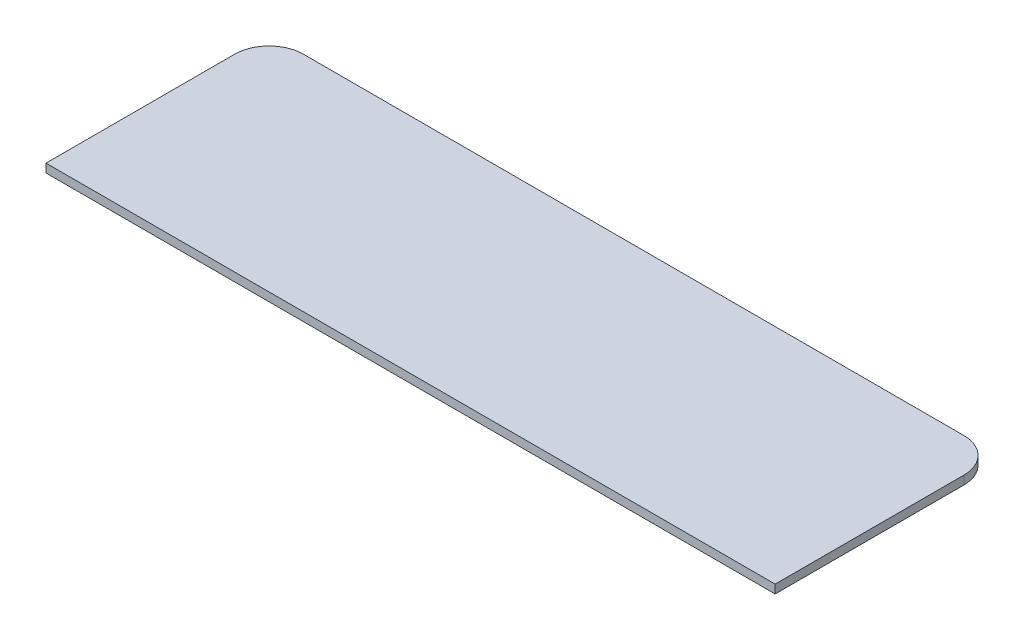
ISO-10303-21;
HEADER;
FILE_DESCRIPTION(('STEP AP214'),'2;1');
FILE_NAME('part.step','',(''),(''),'','','');
FILE_SCHEMA(('AUTOMOTIVE_DESIGN { 1 0 10303 214 1 1 1 1 }'));
ENDSEC;
DATA;
#1=APPLICATION_CONTEXT('core data for automotive mechanical design processes');
#2=APPLICATION_PROTOCOL_DEFINITION('international standard','automotive_design',2000,#1);
#3=PRODUCT_CONTEXT('',#1,'mechanical');
#4=PRODUCT('Part','Part','',(#3));
#5=PRODUCT_RELATED_PRODUCT_CATEGORY('part','',(#4));
#6=PRODUCT_DEFINITION_FORMATION('','',#4);
#7=PRODUCT_DEFINITION_CONTEXT('part definition',#1,'design');
#8=PRODUCT_DEFINITION('design','',#6,#7);
#9=PRODUCT_DEFINITION_SHAPE('','',#8);
#10=(LENGTH_UNIT() NAMED_UNIT(*) SI_UNIT(.MILLI.,.METRE.));
#11=(NAMED_UNIT(*) PLANE_ANGLE_UNIT() SI_UNIT($,.RADIAN.));
#12=(NAMED_UNIT(*) SI_UNIT($,.STERADIAN.) SOLID_ANGLE_UNIT());
#13=UNCERTAINTY_MEASURE_WITH_UNIT(LENGTH_MEASURE(1.E-05),#10,'distance_accuracy_value','');
#14=(GEOMETRIC_REPRESENTATION_CONTEXT(3) GLOBAL_UNCERTAINTY_ASSIGNED_CONTEXT((#13)) GLOBAL_UNIT_ASSIGNED_CONTEXT((#10,
#11,#12)) REPRESENTATION_CONTEXT('',''));
#15=CARTESIAN_POINT('',(0.,0.,0.));
#16=DIRECTION('',(0.,0.,1.));
#17=DIRECTION('',(1.,0.,0.));
#18=AXIS2_PLACEMENT_3D('',#15,#16,#17);
#19=CARTESIAN_POINT('',(42.5,1.,-8.99999999999997));
#20=DIRECTION('',(-1.,0.,0.));
#21=DIRECTION('',(0.,0.,1.));
#22=AXIS2_PLACEMENT_3D('',#19,#20,#21);
#23=PLANE('',#22);
#24=DIRECTION('',(0.,0.,-1.));
#25=VECTOR('',#24,1.);
#26=CARTESIAN_POINT('',(42.5,0.,-8.99999999999997));
#27=LINE('',#26,#25);
#28=CARTESIAN_POINT('',(42.5,0.,13.));
#29=VERTEX_POINT('',#28);
#30=CARTESIAN_POINT('',(42.5,0.,-8.99999999999997));
#31=VERTEX_POINT('',#30);
#32=EDGE_CURVE('E128',#29,#31,#27,.T.);
#33=ORIENTED_EDGE('',*,*,#32,.T.);
#34=DIRECTION('',(0.,-1.,0.));
#35=VECTOR('',#34,1.);
#36=CARTESIAN_POINT('',(42.5,1.,-8.99999999999997));
#37=LINE('',#36,#35);
#38=CARTESIAN_POINT('',(42.5,1.,-8.99999999999997));
#39=VERTEX_POINT('',#38);
#40=EDGE_CURVE('E11',#39,#31,#37,.T.);
#41=ORIENTED_EDGE('',*,*,#40,.F.);
#42=DIRECTION('',(0.,0.,-1.));
#43=VECTOR('',#42,1.);
#44=CARTESIAN_POINT('',(42.5,1.,-8.99999999999997));
#45=LINE('',#44,#43);
#46=CARTESIAN_POINT('',(42.5,1.,13.));
#47=VERTEX_POINT('',#46);
#48=EDGE_CURVE('E144',#47,#39,#45,.T.);
#49=ORIENTED_EDGE('',*,*,#48,.F.);
#50=DIRECTION('',(0.,-1.,0.));
#51=VECTOR('',#50,1.);
#52=CARTESIAN_POINT('',(42.5,1.,13.));
#53=LINE('',#52,#51);
#54=EDGE_CURVE('E124',#47,#29,#53,.T.);
#55=ORIENTED_EDGE('',*,*,#54,.T.);
#56=EDGE_LOOP('',(#33,#41,#49,#55));
#57=FACE_BOUND('',#56,.T.);
#58=ADVANCED_FACE('F39',(#57),#23,.F.);
#59=CARTESIAN_POINT('',(38.5,1.,-9.));
#60=DIRECTION('',(0.,-1.,0.));
#61=DIRECTION('',(0.,0.,-1.));
#62=AXIS2_PLACEMENT_3D('',#59,#60,#61);
#63=CYLINDRICAL_SURFACE('',#62,4.);
#64=CARTESIAN_POINT('',(38.5,0.,-9.));
#65=DIRECTION('',(0.,1.,0.));
#66=DIRECTION('',(0.,0.,1.));
#67=AXIS2_PLACEMENT_3D('',#64,#65,#66);
#68=CIRCLE('',#67,4.);
#69=CARTESIAN_POINT('',(38.5,0.,-13.));
#70=VERTEX_POINT('',#69);
#71=EDGE_CURVE('E132',#31,#70,#68,.T.);
#72=ORIENTED_EDGE('',*,*,#71,.T.);
#73=DIRECTION('',(0.,-1.,0.));
#74=VECTOR('',#73,1.);
#75=CARTESIAN_POINT('',(38.5,1.,-13.));
#76=LINE('',#75,#74);
#77=CARTESIAN_POINT('',(38.5,1.,-13.));
#78=VERTEX_POINT('',#77);
#79=EDGE_CURVE('E48',#78,#70,#76,.T.);
#80=ORIENTED_EDGE('',*,*,#79,.F.);
#81=CARTESIAN_POINT('',(38.5,1.,-9.));
#82=DIRECTION('',(0.,1.,0.));
#83=DIRECTION('',(0.,0.,1.));
#84=AXIS2_PLACEMENT_3D('',#81,#82,#83);
#85=CIRCLE('',#84,4.);
#86=EDGE_CURVE('E93',#39,#78,#85,.T.);
#87=ORIENTED_EDGE('',*,*,#86,.F.);
#88=ORIENTED_EDGE('',*,*,#40,.T.);
#89=EDGE_LOOP('',(#72,#80,#87,#88));
#90=FACE_BOUND('',#89,.T.);
#91=ADVANCED_FACE('F172',(#90),#63,.T.);
#92=CARTESIAN_POINT('',(-38.5,1.,-13.));
#93=DIRECTION('',(0.,0.,1.));
#94=DIRECTION('',(1.,0.,0.));
#95=AXIS2_PLACEMENT_3D('',#92,#93,#94);
#96=PLANE('',#95);
#97=DIRECTION('',(-1.,0.,0.));
#98=VECTOR('',#97,1.);
#99=CARTESIAN_POINT('',(-38.5,0.,-13.));
#100=LINE('',#99,#98);
#101=CARTESIAN_POINT('',(-38.5,0.,-13.));
#102=VERTEX_POINT('',#101);
#103=EDGE_CURVE('E135',#70,#102,#100,.T.);
#104=ORIENTED_EDGE('',*,*,#103,.T.);
#105=DIRECTION('',(0.,-1.,0.));
#106=VECTOR('',#105,1.);
#107=CARTESIAN_POINT('',(-38.5,1.,-13.));
#108=LINE('',#107,#106);
#109=CARTESIAN_POINT('',(-38.5,1.,-13.));
#110=VERTEX_POINT('',#109);
#111=EDGE_CURVE('E117',#110,#102,#108,.T.);
#112=ORIENTED_EDGE('',*,*,#111,.F.);
#113=DIRECTION('',(-1.,0.,0.));
#114=VECTOR('',#113,1.);
#115=CARTESIAN_POINT('',(-38.5,1.,-13.));
#116=LINE('',#115,#114);
#117=EDGE_CURVE('E106',#78,#110,#116,.T.);
#118=ORIENTED_EDGE('',*,*,#117,.F.);
#119=ORIENTED_EDGE('',*,*,#79,.T.);
#120=EDGE_LOOP('',(#104,#112,#118,#119));
#121=FACE_BOUND('',#120,.T.);
#122=ADVANCED_FACE('F154',(#121),#96,.F.);
#123=CARTESIAN_POINT('',(-38.5,1.,-9.));
#124=DIRECTION('',(0.,-1.,0.));
#125=DIRECTION('',(0.,0.,-1.));
#126=AXIS2_PLACEMENT_3D('',#123,#124,#125);
#127=CYLINDRICAL_SURFACE('',#126,4.);
#128=CARTESIAN_POINT('',(-38.5,0.,-9.));
#129=DIRECTION('',(0.,1.,0.));
#130=DIRECTION('',(0.,0.,1.));
#131=AXIS2_PLACEMENT_3D('',#128,#129,#130);
#132=CIRCLE('',#131,4.);
#133=CARTESIAN_POINT('',(-42.5,0.,-8.99999999999997));
#134=VERTEX_POINT('',#133);
#135=EDGE_CURVE('E115',#102,#134,#132,.T.);
#136=ORIENTED_EDGE('',*,*,#135,.T.);
#137=DIRECTION('',(0.,-1.,0.));
#138=VECTOR('',#137,1.);
#139=CARTESIAN_POINT('',(-42.5,1.,-8.99999999999997));
#140=LINE('',#139,#138);
#141=CARTESIAN_POINT('',(-42.5,1.,-8.99999999999997));
#142=VERTEX_POINT('',#141);
#143=EDGE_CURVE('E112',#142,#134,#140,.T.);
#144=ORIENTED_EDGE('',*,*,#143,.F.);
#145=CARTESIAN_POINT('',(-38.5,1.,-9.));
#146=DIRECTION('',(0.,1.,0.));
#147=DIRECTION('',(0.,0.,1.));
#148=AXIS2_PLACEMENT_3D('',#145,#146,#147);
#149=CIRCLE('',#148,4.);
#150=EDGE_CURVE('E100',#110,#142,#149,.T.);
#151=ORIENTED_EDGE('',*,*,#150,.F.);
#152=ORIENTED_EDGE('',*,*,#111,.T.);
#153=EDGE_LOOP('',(#136,#144,#151,#152));
#154=FACE_BOUND('',#153,.T.);
#155=ADVANCED_FACE('F113',(#154),#127,.T.);
#156=CARTESIAN_POINT('',(-42.5,1.,-8.99999999999997));
#157=DIRECTION('',(1.,0.,0.));
#158=DIRECTION('',(0.,0.,-1.));
#159=AXIS2_PLACEMENT_3D('',#156,#157,#158);
#160=PLANE('',#159);
#161=DIRECTION('',(0.,0.,1.));
#162=VECTOR('',#161,1.);
#163=CARTESIAN_POINT('',(-42.5,0.,-8.99999999999997));
#164=LINE('',#163,#162);
#165=CARTESIAN_POINT('',(-42.5,0.,13.));
#166=VERTEX_POINT('',#165);
#167=EDGE_CURVE('E79',#134,#166,#164,.T.);
#168=ORIENTED_EDGE('',*,*,#167,.T.);
#169=DIRECTION('',(0.,-1.,0.));
#170=VECTOR('',#169,1.);
#171=CARTESIAN_POINT('',(-42.5,1.,13.));
#172=LINE('',#171,#170);
#173=CARTESIAN_POINT('',(-42.5,1.,13.));
#174=VERTEX_POINT('',#173);
#175=EDGE_CURVE('E118',#174,#166,#172,.T.);
#176=ORIENTED_EDGE('',*,*,#175,.F.);
#177=DIRECTION('',(0.,0.,1.));
#178=VECTOR('',#177,1.);
#179=CARTESIAN_POINT('',(-42.5,1.,-8.99999999999997));
#180=LINE('',#179,#178);
#181=EDGE_CURVE('E104',#142,#174,#180,.T.);
#182=ORIENTED_EDGE('',*,*,#181,.F.);
#183=ORIENTED_EDGE('',*,*,#143,.T.);
#184=EDGE_LOOP('',(#168,#176,#182,#183));
#185=FACE_BOUND('',#184,.T.);
#186=ADVANCED_FACE('F120',(#185),#160,.F.);
#187=CARTESIAN_POINT('',(-42.5,1.,13.));
#188=DIRECTION('',(0.,0.,-1.));
#189=DIRECTION('',(-1.,0.,0.));
#190=AXIS2_PLACEMENT_3D('',#187,#188,#189);
#191=PLANE('',#190);
#192=DIRECTION('',(1.,0.,0.));
#193=VECTOR('',#192,1.);
#194=CARTESIAN_POINT('',(-42.5,0.,13.));
#195=LINE('',#194,#193);
#196=EDGE_CURVE('E85',#166,#29,#195,.T.);
#197=ORIENTED_EDGE('',*,*,#196,.T.);
#198=ORIENTED_EDGE('',*,*,#54,.F.);
#199=DIRECTION('',(1.,0.,0.));
#200=VECTOR('',#199,1.);
#201=CARTESIAN_POINT('',(-42.5,1.,13.));
#202=LINE('',#201,#200);
#203=EDGE_CURVE('E56',#174,#47,#202,.T.);
#204=ORIENTED_EDGE('',*,*,#203,.F.);
#205=ORIENTED_EDGE('',*,*,#175,.T.);
#206=EDGE_LOOP('',(#197,#198,#204,#205));
#207=FACE_BOUND('',#206,.T.);
#208=ADVANCED_FACE('F161',(#207),#191,.F.);
#209=CARTESIAN_POINT('',(-38.5,1.,-9.));
#210=DIRECTION('',(0.,1.,0.));
#211=DIRECTION('',(0.,0.,1.));
#212=AXIS2_PLACEMENT_3D('',#209,#210,#211);
#213=PLANE('',#212);
#214=ORIENTED_EDGE('',*,*,#48,.T.);
#215=ORIENTED_EDGE('',*,*,#86,.T.);
#216=ORIENTED_EDGE('',*,*,#117,.T.);
#217=ORIENTED_EDGE('',*,*,#150,.T.);
#218=ORIENTED_EDGE('',*,*,#181,.T.);
#219=ORIENTED_EDGE('',*,*,#203,.T.);
#220=EDGE_LOOP('',(#214,#215,#216,#217,#218,#219));
#221=FACE_BOUND('',#220,.T.);
#222=ADVANCED_FACE('F102',(#221),#213,.T.);
#223=CARTESIAN_POINT('',(-38.5,0.,-9.));
#224=DIRECTION('',(0.,1.,0.));
#225=DIRECTION('',(0.,0.,1.));
#226=AXIS2_PLACEMENT_3D('',#223,#224,#225);
#227=PLANE('',#226);
#228=ORIENTED_EDGE('',*,*,#32,.F.);
#229=ORIENTED_EDGE('',*,*,#196,.F.);
#230=ORIENTED_EDGE('',*,*,#167,.F.);
#231=ORIENTED_EDGE('',*,*,#135,.F.);
#232=ORIENTED_EDGE('',*,*,#103,.F.);
#233=ORIENTED_EDGE('',*,*,#71,.F.);
#234=EDGE_LOOP('',(#228,#229,#230,#231,#232,#233));
#235=FACE_BOUND('',#234,.T.);
#236=ADVANCED_FACE('F157',(#235),#227,.F.);
#237=CLOSED_SHELL('',(#58,#91,#122,#155,#186,#208,#222,#236));
#238=MANIFOLD_SOLID_BREP('B2',#237);
#239=ADVANCED_BREP_SHAPE_REPRESENTATION('',(#18,#238),#14);
#240=SHAPE_DEFINITION_REPRESENTATION(#9,#239);
ENDSEC;
END-ISO-10303-21;
